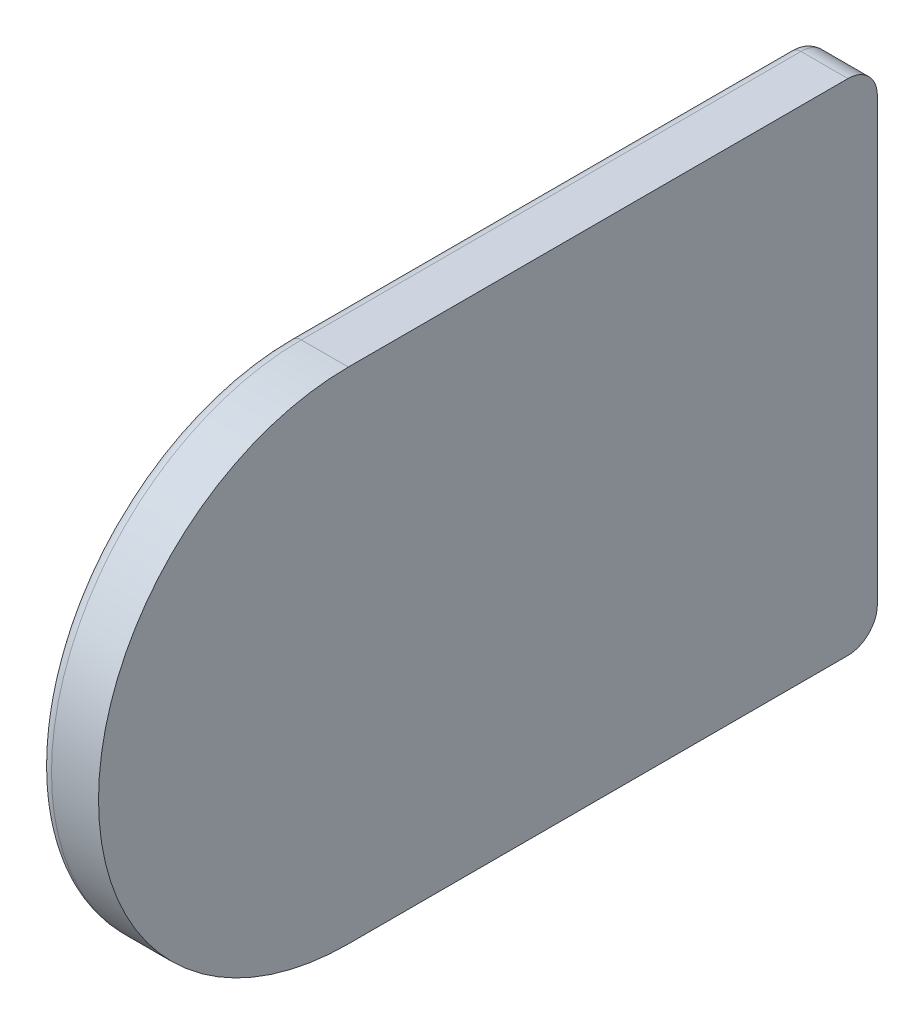
ISO-10303-21;
HEADER;
FILE_DESCRIPTION(('STEP AP214'),'2;1');
FILE_NAME('part.step','',(''),(''),'','','');
FILE_SCHEMA(('AUTOMOTIVE_DESIGN { 1 0 10303 214 1 1 1 1 }'));
ENDSEC;
DATA;
#1=APPLICATION_CONTEXT('core data for automotive mechanical design processes');
#2=APPLICATION_PROTOCOL_DEFINITION('international standard','automotive_design',2000,#1);
#3=PRODUCT_CONTEXT('',#1,'mechanical');
#4=PRODUCT('Part','Part','',(#3));
#5=PRODUCT_RELATED_PRODUCT_CATEGORY('part','',(#4));
#6=PRODUCT_DEFINITION_FORMATION('','',#4);
#7=PRODUCT_DEFINITION_CONTEXT('part definition',#1,'design');
#8=PRODUCT_DEFINITION('design','',#6,#7);
#9=PRODUCT_DEFINITION_SHAPE('','',#8);
#10=(LENGTH_UNIT() NAMED_UNIT(*) SI_UNIT(.MILLI.,.METRE.));
#11=(NAMED_UNIT(*) PLANE_ANGLE_UNIT() SI_UNIT($,.RADIAN.));
#12=(NAMED_UNIT(*) SI_UNIT($,.STERADIAN.) SOLID_ANGLE_UNIT());
#13=UNCERTAINTY_MEASURE_WITH_UNIT(LENGTH_MEASURE(1.E-05),#10,'distance_accuracy_value','');
#14=(GEOMETRIC_REPRESENTATION_CONTEXT(3) GLOBAL_UNCERTAINTY_ASSIGNED_CONTEXT((#13)) GLOBAL_UNIT_ASSIGNED_CONTEXT((#10,
#11,#12)) REPRESENTATION_CONTEXT('',''));
#15=CARTESIAN_POINT('',(0.,0.,0.));
#16=DIRECTION('',(0.,0.,1.));
#17=DIRECTION('',(1.,0.,0.));
#18=AXIS2_PLACEMENT_3D('',#15,#16,#17);
#19=CARTESIAN_POINT('',(0.,0.,45.));
#20=DIRECTION('',(1.,0.,0.));
#21=DIRECTION('',(0.,0.,-1.));
#22=AXIS2_PLACEMENT_3D('',#19,#20,#21);
#23=PLANE('',#22);
#24=DIRECTION('',(0.,0.,-1.));
#25=VECTOR('',#24,1.);
#26=CARTESIAN_POINT('',(0.,-16.25,1.99999999999998));
#27=LINE('',#26,#25);
#28=CARTESIAN_POINT('',(0.,-16.25,23.));
#29=VERTEX_POINT('',#28);
#30=CARTESIAN_POINT('',(0.,-16.25,1.99999999999998));
#31=VERTEX_POINT('',#30);
#32=EDGE_CURVE('E188',#29,#31,#27,.T.);
#33=ORIENTED_EDGE('',*,*,#32,.T.);
#34=DIRECTION('',(0.,1.,0.));
#35=VECTOR('',#34,1.);
#36=CARTESIAN_POINT('',(0.,-13.75,1.99999999999998));
#37=LINE('',#36,#35);
#38=CARTESIAN_POINT('',(0.,-13.75,1.99999999999998));
#39=VERTEX_POINT('',#38);
#40=EDGE_CURVE('E161',#31,#39,#37,.T.);
#41=ORIENTED_EDGE('',*,*,#40,.T.);
#42=DIRECTION('',(0.,0.,1.));
#43=VECTOR('',#42,1.);
#44=CARTESIAN_POINT('',(0.,-13.75,1.99999999999998));
#45=LINE('',#44,#43);
#46=CARTESIAN_POINT('',(0.,-13.75,23.));
#47=VERTEX_POINT('',#46);
#48=EDGE_CURVE('E177',#39,#47,#45,.T.);
#49=ORIENTED_EDGE('',*,*,#48,.T.);
#50=DIRECTION('',(0.,-1.,0.));
#51=VECTOR('',#50,1.);
#52=CARTESIAN_POINT('',(0.,-13.75,23.));
#53=LINE('',#52,#51);
#54=EDGE_CURVE('E52',#47,#29,#53,.T.);
#55=ORIENTED_EDGE('',*,*,#54,.T.);
#56=EDGE_LOOP('',(#33,#41,#49,#55));
#57=FACE_BOUND('',#56,.T.);
#58=CARTESIAN_POINT('',(0.,-37.5,-40.));
#59=DIRECTION('',(1.,0.,0.));
#60=DIRECTION('',(0.,0.,-1.));
#61=AXIS2_PLACEMENT_3D('',#58,#59,#60);
#62=CIRCLE('',#61,2.99999999999999);
#63=CARTESIAN_POINT('',(0.,-37.5,-43.));
#64=VERTEX_POINT('',#63);
#65=CARTESIAN_POINT('',(0.,-40.5,-40.));
#66=VERTEX_POINT('',#65);
#67=EDGE_CURVE('E271',#64,#66,#62,.F.);
#68=ORIENTED_EDGE('',*,*,#67,.T.);
#69=DIRECTION('',(0.,0.,-1.));
#70=VECTOR('',#69,1.);
#71=CARTESIAN_POINT('',(0.,-40.5,45.));
#72=LINE('',#71,#70);
#73=CARTESIAN_POINT('',(0.,-40.5,45.));
#74=VERTEX_POINT('',#73);
#75=EDGE_CURVE('E273',#66,#74,#72,.F.);
#76=ORIENTED_EDGE('',*,*,#75,.T.);
#77=CARTESIAN_POINT('',(0.,0.,45.));
#78=DIRECTION('',(1.,0.,0.));
#79=DIRECTION('',(0.,0.,-1.));
#80=AXIS2_PLACEMENT_3D('',#77,#78,#79);
#81=CIRCLE('',#80,40.5);
#82=CARTESIAN_POINT('',(0.,40.5,45.));
#83=VERTEX_POINT('',#82);
#84=EDGE_CURVE('E263',#74,#83,#81,.F.);
#85=ORIENTED_EDGE('',*,*,#84,.T.);
#86=DIRECTION('',(0.,0.,1.));
#87=VECTOR('',#86,1.);
#88=CARTESIAN_POINT('',(0.,40.5,45.));
#89=LINE('',#88,#87);
#90=CARTESIAN_POINT('',(0.,40.5,-40.));
#91=VERTEX_POINT('',#90);
#92=EDGE_CURVE('E265',#83,#91,#89,.F.);
#93=ORIENTED_EDGE('',*,*,#92,.T.);
#94=CARTESIAN_POINT('',(0.,37.5,-40.));
#95=DIRECTION('',(1.,0.,0.));
#96=DIRECTION('',(0.,0.,-1.));
#97=AXIS2_PLACEMENT_3D('',#94,#95,#96);
#98=CIRCLE('',#97,2.99999999999999);
#99=CARTESIAN_POINT('',(0.,37.5,-43.));
#100=VERTEX_POINT('',#99);
#101=EDGE_CURVE('E267',#91,#100,#98,.F.);
#102=ORIENTED_EDGE('',*,*,#101,.T.);
#103=DIRECTION('',(0.,1.,0.));
#104=VECTOR('',#103,1.);
#105=CARTESIAN_POINT('',(0.,0.,-43.));
#106=LINE('',#105,#104);
#107=EDGE_CURVE('E269',#100,#64,#106,.F.);
#108=ORIENTED_EDGE('',*,*,#107,.T.);
#109=EDGE_LOOP('',(#68,#76,#85,#93,#102,#108));
#110=FACE_BOUND('',#109,.T.);
#111=DIRECTION('',(0.,-1.,0.));
#112=VECTOR('',#111,1.);
#113=CARTESIAN_POINT('',(0.,13.75,1.99999999999998));
#114=LINE('',#113,#112);
#115=CARTESIAN_POINT('',(0.,16.25,1.99999999999998));
#116=VERTEX_POINT('',#115);
#117=CARTESIAN_POINT('',(0.,13.75,1.99999999999999));
#118=VERTEX_POINT('',#117);
#119=EDGE_CURVE('E166',#116,#118,#114,.T.);
#120=ORIENTED_EDGE('',*,*,#119,.F.);
#121=DIRECTION('',(0.,0.,-1.));
#122=VECTOR('',#121,1.);
#123=CARTESIAN_POINT('',(0.,16.25,1.99999999999998));
#124=LINE('',#123,#122);
#125=CARTESIAN_POINT('',(0.,16.25,23.));
#126=VERTEX_POINT('',#125);
#127=EDGE_CURVE('E202',#126,#116,#124,.T.);
#128=ORIENTED_EDGE('',*,*,#127,.F.);
#129=DIRECTION('',(0.,1.,0.));
#130=VECTOR('',#129,1.);
#131=CARTESIAN_POINT('',(0.,13.75,23.));
#132=LINE('',#131,#130);
#133=CARTESIAN_POINT('',(0.,13.75,23.));
#134=VERTEX_POINT('',#133);
#135=EDGE_CURVE('E212',#134,#126,#132,.T.);
#136=ORIENTED_EDGE('',*,*,#135,.F.);
#137=DIRECTION('',(0.,0.,1.));
#138=VECTOR('',#137,1.);
#139=CARTESIAN_POINT('',(0.,13.75,1.99999999999998));
#140=LINE('',#139,#138);
#141=EDGE_CURVE('E60',#118,#134,#140,.T.);
#142=ORIENTED_EDGE('',*,*,#141,.F.);
#143=EDGE_LOOP('',(#120,#128,#136,#142));
#144=FACE_BOUND('',#143,.T.);
#145=ADVANCED_FACE('F35',(#57,#110,#144),#23,.F.);
#146=CARTESIAN_POINT('',(10.,0.,45.));
#147=DIRECTION('',(-1.,0.,0.));
#148=DIRECTION('',(0.,0.,1.));
#149=AXIS2_PLACEMENT_3D('',#146,#147,#148);
#150=CYLINDRICAL_SURFACE('',#149,42.5);
#151=DIRECTION('',(-1.,0.,0.));
#152=VECTOR('',#151,1.);
#153=CARTESIAN_POINT('',(10.,42.5,45.));
#154=LINE('',#153,#152);
#155=CARTESIAN_POINT('',(10.,42.5,45.));
#156=VERTEX_POINT('',#155);
#157=CARTESIAN_POINT('',(2.,42.5,45.));
#158=VERTEX_POINT('',#157);
#159=EDGE_CURVE('E242',#156,#158,#154,.T.);
#160=ORIENTED_EDGE('',*,*,#159,.T.);
#161=CARTESIAN_POINT('',(2.,0.,45.));
#162=DIRECTION('',(1.,0.,0.));
#163=DIRECTION('',(0.,0.,-1.));
#164=AXIS2_PLACEMENT_3D('',#161,#162,#163);
#165=CIRCLE('',#164,42.5);
#166=CARTESIAN_POINT('',(2.,-42.5,45.));
#167=VERTEX_POINT('',#166);
#168=EDGE_CURVE('E11',#158,#167,#165,.T.);
#169=ORIENTED_EDGE('',*,*,#168,.T.);
#170=DIRECTION('',(-1.,0.,0.));
#171=VECTOR('',#170,1.);
#172=CARTESIAN_POINT('',(10.,-42.5,45.));
#173=LINE('',#172,#171);
#174=CARTESIAN_POINT('',(10.,-42.5,45.));
#175=VERTEX_POINT('',#174);
#176=EDGE_CURVE('E257',#175,#167,#173,.T.);
#177=ORIENTED_EDGE('',*,*,#176,.F.);
#178=CARTESIAN_POINT('',(10.,0.,45.));
#179=DIRECTION('',(1.,0.,0.));
#180=DIRECTION('',(0.,0.,-1.));
#181=AXIS2_PLACEMENT_3D('',#178,#179,#180);
#182=CIRCLE('',#181,42.5);
#183=EDGE_CURVE('E228',#156,#175,#182,.T.);
#184=ORIENTED_EDGE('',*,*,#183,.F.);
#185=EDGE_LOOP('',(#160,#169,#177,#184));
#186=FACE_BOUND('',#185,.T.);
#187=ADVANCED_FACE('F317',(#186),#150,.T.);
#188=CARTESIAN_POINT('',(10.,-42.5,45.));
#189=DIRECTION('',(0.,1.,0.));
#190=DIRECTION('',(0.,0.,1.));
#191=AXIS2_PLACEMENT_3D('',#188,#189,#190);
#192=PLANE('',#191);
#193=ORIENTED_EDGE('',*,*,#176,.T.);
#194=DIRECTION('',(0.,0.,-1.));
#195=VECTOR('',#194,1.);
#196=CARTESIAN_POINT('',(2.,-42.5,45.));
#197=LINE('',#196,#195);
#198=CARTESIAN_POINT('',(2.,-42.5,-40.));
#199=VERTEX_POINT('',#198);
#200=EDGE_CURVE('E260',#167,#199,#197,.T.);
#201=ORIENTED_EDGE('',*,*,#200,.T.);
#202=DIRECTION('',(-1.,0.,0.));
#203=VECTOR('',#202,1.);
#204=CARTESIAN_POINT('',(10.,-42.5,-40.));
#205=LINE('',#204,#203);
#206=CARTESIAN_POINT('',(10.,-42.5,-40.));
#207=VERTEX_POINT('',#206);
#208=EDGE_CURVE('E254',#207,#199,#205,.T.);
#209=ORIENTED_EDGE('',*,*,#208,.F.);
#210=DIRECTION('',(0.,0.,-1.));
#211=VECTOR('',#210,1.);
#212=CARTESIAN_POINT('',(10.,-42.5,45.));
#213=LINE('',#212,#211);
#214=EDGE_CURVE('E231',#175,#207,#213,.T.);
#215=ORIENTED_EDGE('',*,*,#214,.F.);
#216=EDGE_LOOP('',(#193,#201,#209,#215));
#217=FACE_BOUND('',#216,.T.);
#218=ADVANCED_FACE('F321',(#217),#192,.F.);
#219=CARTESIAN_POINT('',(10.,-37.5,-40.));
#220=DIRECTION('',(-1.,0.,0.));
#221=DIRECTION('',(0.,0.,1.));
#222=AXIS2_PLACEMENT_3D('',#219,#220,#221);
#223=CYLINDRICAL_SURFACE('',#222,4.99999999999999);
#224=ORIENTED_EDGE('',*,*,#208,.T.);
#225=CARTESIAN_POINT('',(2.,-37.5,-40.));
#226=DIRECTION('',(1.,0.,0.));
#227=DIRECTION('',(0.,0.,-1.));
#228=AXIS2_PLACEMENT_3D('',#225,#226,#227);
#229=CIRCLE('',#228,4.99999999999999);
#230=CARTESIAN_POINT('',(2.,-37.5,-45.));
#231=VERTEX_POINT('',#230);
#232=EDGE_CURVE('E276',#199,#231,#229,.T.);
#233=ORIENTED_EDGE('',*,*,#232,.T.);
#234=DIRECTION('',(-1.,0.,0.));
#235=VECTOR('',#234,1.);
#236=CARTESIAN_POINT('',(10.,-37.5,-45.));
#237=LINE('',#236,#235);
#238=CARTESIAN_POINT('',(10.,-37.5,-45.));
#239=VERTEX_POINT('',#238);
#240=EDGE_CURVE('E251',#239,#231,#237,.T.);
#241=ORIENTED_EDGE('',*,*,#240,.F.);
#242=CARTESIAN_POINT('',(10.,-37.5,-40.));
#243=DIRECTION('',(1.,0.,0.));
#244=DIRECTION('',(0.,0.,-1.));
#245=AXIS2_PLACEMENT_3D('',#242,#243,#244);
#246=CIRCLE('',#245,4.99999999999999);
#247=EDGE_CURVE('E234',#207,#239,#246,.T.);
#248=ORIENTED_EDGE('',*,*,#247,.F.);
#249=EDGE_LOOP('',(#224,#233,#241,#248));
#250=FACE_BOUND('',#249,.T.);
#251=ADVANCED_FACE('F374',(#250),#223,.T.);
#252=CARTESIAN_POINT('',(10.,-37.5,-45.));
#253=DIRECTION('',(0.,0.,1.));
#254=DIRECTION('',(0.,-1.,0.));
#255=AXIS2_PLACEMENT_3D('',#252,#253,#254);
#256=PLANE('',#255);
#257=ORIENTED_EDGE('',*,*,#240,.T.);
#258=DIRECTION('',(0.,1.,0.));
#259=VECTOR('',#258,1.);
#260=CARTESIAN_POINT('',(2.,-37.5,-45.));
#261=LINE('',#260,#259);
#262=CARTESIAN_POINT('',(2.,37.5,-45.));
#263=VERTEX_POINT('',#262);
#264=EDGE_CURVE('E278',#231,#263,#261,.T.);
#265=ORIENTED_EDGE('',*,*,#264,.T.);
#266=DIRECTION('',(-1.,0.,0.));
#267=VECTOR('',#266,1.);
#268=CARTESIAN_POINT('',(10.,37.5,-45.));
#269=LINE('',#268,#267);
#270=CARTESIAN_POINT('',(10.,37.5,-45.));
#271=VERTEX_POINT('',#270);
#272=EDGE_CURVE('E248',#271,#263,#269,.T.);
#273=ORIENTED_EDGE('',*,*,#272,.F.);
#274=DIRECTION('',(0.,1.,0.));
#275=VECTOR('',#274,1.);
#276=CARTESIAN_POINT('',(10.,-37.5,-45.));
#277=LINE('',#276,#275);
#278=EDGE_CURVE('E236',#239,#271,#277,.T.);
#279=ORIENTED_EDGE('',*,*,#278,.F.);
#280=EDGE_LOOP('',(#257,#265,#273,#279));
#281=FACE_BOUND('',#280,.T.);
#282=ADVANCED_FACE('F336',(#281),#256,.F.);
#283=CARTESIAN_POINT('',(10.,37.5,-40.));
#284=DIRECTION('',(-1.,0.,0.));
#285=DIRECTION('',(0.,0.,1.));
#286=AXIS2_PLACEMENT_3D('',#283,#284,#285);
#287=CYLINDRICAL_SURFACE('',#286,4.99999999999999);
#288=ORIENTED_EDGE('',*,*,#272,.T.);
#289=CARTESIAN_POINT('',(2.,37.5,-40.));
#290=DIRECTION('',(1.,0.,0.));
#291=DIRECTION('',(0.,0.,-1.));
#292=AXIS2_PLACEMENT_3D('',#289,#290,#291);
#293=CIRCLE('',#292,4.99999999999999);
#294=CARTESIAN_POINT('',(2.,42.5,-40.));
#295=VERTEX_POINT('',#294);
#296=EDGE_CURVE('E280',#263,#295,#293,.T.);
#297=ORIENTED_EDGE('',*,*,#296,.T.);
#298=DIRECTION('',(-1.,0.,0.));
#299=VECTOR('',#298,1.);
#300=CARTESIAN_POINT('',(10.,42.5,-40.));
#301=LINE('',#300,#299);
#302=CARTESIAN_POINT('',(10.,42.5,-40.));
#303=VERTEX_POINT('',#302);
#304=EDGE_CURVE('E245',#303,#295,#301,.T.);
#305=ORIENTED_EDGE('',*,*,#304,.F.);
#306=CARTESIAN_POINT('',(10.,37.5,-40.));
#307=DIRECTION('',(1.,0.,0.));
#308=DIRECTION('',(0.,0.,1.));
#309=AXIS2_PLACEMENT_3D('',#306,#307,#308);
#310=CIRCLE('',#309,4.99999999999999);
#311=EDGE_CURVE('E238',#271,#303,#310,.T.);
#312=ORIENTED_EDGE('',*,*,#311,.F.);
#313=EDGE_LOOP('',(#288,#297,#305,#312));
#314=FACE_BOUND('',#313,.T.);
#315=ADVANCED_FACE('F332',(#314),#287,.T.);
#316=CARTESIAN_POINT('',(10.,42.5,45.));
#317=DIRECTION('',(0.,-1.,0.));
#318=DIRECTION('',(0.,0.,-1.));
#319=AXIS2_PLACEMENT_3D('',#316,#317,#318);
#320=PLANE('',#319);
#321=ORIENTED_EDGE('',*,*,#304,.T.);
#322=DIRECTION('',(0.,0.,1.));
#323=VECTOR('',#322,1.);
#324=CARTESIAN_POINT('',(2.,42.5,45.));
#325=LINE('',#324,#323);
#326=EDGE_CURVE('E44',#295,#158,#325,.T.);
#327=ORIENTED_EDGE('',*,*,#326,.T.);
#328=ORIENTED_EDGE('',*,*,#159,.F.);
#329=DIRECTION('',(0.,0.,1.));
#330=VECTOR('',#329,1.);
#331=CARTESIAN_POINT('',(10.,42.5,45.));
#332=LINE('',#331,#330);
#333=EDGE_CURVE('E240',#303,#156,#332,.T.);
#334=ORIENTED_EDGE('',*,*,#333,.F.);
#335=EDGE_LOOP('',(#321,#327,#328,#334));
#336=FACE_BOUND('',#335,.T.);
#337=ADVANCED_FACE('F330',(#336),#320,.F.);
#338=CARTESIAN_POINT('',(10.,0.,45.));
#339=DIRECTION('',(1.,0.,0.));
#340=DIRECTION('',(0.,0.,-1.));
#341=AXIS2_PLACEMENT_3D('',#338,#339,#340);
#342=PLANE('',#341);
#343=ORIENTED_EDGE('',*,*,#183,.T.);
#344=ORIENTED_EDGE('',*,*,#214,.T.);
#345=ORIENTED_EDGE('',*,*,#247,.T.);
#346=ORIENTED_EDGE('',*,*,#278,.T.);
#347=ORIENTED_EDGE('',*,*,#311,.T.);
#348=ORIENTED_EDGE('',*,*,#333,.T.);
#349=EDGE_LOOP('',(#343,#344,#345,#346,#347,#348));
#350=FACE_BOUND('',#349,.T.);
#351=ADVANCED_FACE('F325',(#350),#342,.T.);
#352=CARTESIAN_POINT('',(2.,37.5,-40.));
#353=DIRECTION('',(1.,0.,0.));
#354=DIRECTION('',(0.,0.,-1.));
#355=AXIS2_PLACEMENT_3D('',#352,#353,#354);
#356=TOROIDAL_SURFACE('',#355,2.99999999999999,2.);
#357=CARTESIAN_POINT('',(2.,37.5,-43.));
#358=DIRECTION('',(0.,-1.,0.));
#359=DIRECTION('',(0.,0.,-1.));
#360=AXIS2_PLACEMENT_3D('',#357,#358,#359);
#361=CIRCLE('',#360,2.);
#362=EDGE_CURVE('E292',#100,#263,#361,.T.);
#363=ORIENTED_EDGE('',*,*,#362,.F.);
#364=ORIENTED_EDGE('',*,*,#101,.F.);
#365=CARTESIAN_POINT('',(2.,40.5,-40.));
#366=DIRECTION('',(0.,0.,1.));
#367=DIRECTION('',(1.,0.,0.));
#368=AXIS2_PLACEMENT_3D('',#365,#366,#367);
#369=CIRCLE('',#368,2.);
#370=EDGE_CURVE('E232',#295,#91,#369,.T.);
#371=ORIENTED_EDGE('',*,*,#370,.F.);
#372=ORIENTED_EDGE('',*,*,#296,.F.);
#373=EDGE_LOOP('',(#363,#364,#371,#372));
#374=FACE_BOUND('',#373,.T.);
#375=ADVANCED_FACE('F37',(#374),#356,.T.);
#376=CARTESIAN_POINT('',(2.,40.5,45.));
#377=DIRECTION('',(0.,0.,1.));
#378=DIRECTION('',(1.,0.,0.));
#379=AXIS2_PLACEMENT_3D('',#376,#377,#378);
#380=CYLINDRICAL_SURFACE('',#379,2.);
#381=ORIENTED_EDGE('',*,*,#370,.T.);
#382=ORIENTED_EDGE('',*,*,#92,.F.);
#383=CARTESIAN_POINT('',(2.,40.5,45.));
#384=DIRECTION('',(0.,0.,1.));
#385=DIRECTION('',(1.,0.,0.));
#386=AXIS2_PLACEMENT_3D('',#383,#384,#385);
#387=CIRCLE('',#386,2.);
#388=EDGE_CURVE('E289',#158,#83,#387,.T.);
#389=ORIENTED_EDGE('',*,*,#388,.F.);
#390=ORIENTED_EDGE('',*,*,#326,.F.);
#391=EDGE_LOOP('',(#381,#382,#389,#390));
#392=FACE_BOUND('',#391,.T.);
#393=ADVANCED_FACE('F299',(#392),#380,.T.);
#394=CARTESIAN_POINT('',(2.,-37.5,-43.));
#395=DIRECTION('',(0.,1.,0.));
#396=DIRECTION('',(0.,0.,1.));
#397=AXIS2_PLACEMENT_3D('',#394,#395,#396);
#398=CYLINDRICAL_SURFACE('',#397,2.);
#399=ORIENTED_EDGE('',*,*,#362,.T.);
#400=ORIENTED_EDGE('',*,*,#264,.F.);
#401=CARTESIAN_POINT('',(2.,-37.5,-43.));
#402=DIRECTION('',(0.,-1.,0.));
#403=DIRECTION('',(0.,0.,-1.));
#404=AXIS2_PLACEMENT_3D('',#401,#402,#403);
#405=CIRCLE('',#404,2.);
#406=EDGE_CURVE('E286',#64,#231,#405,.T.);
#407=ORIENTED_EDGE('',*,*,#406,.F.);
#408=ORIENTED_EDGE('',*,*,#107,.F.);
#409=EDGE_LOOP('',(#399,#400,#407,#408));
#410=FACE_BOUND('',#409,.T.);
#411=ADVANCED_FACE('F340',(#410),#398,.T.);
#412=CARTESIAN_POINT('',(2.,0.,45.));
#413=DIRECTION('',(1.,0.,0.));
#414=DIRECTION('',(0.,0.,-1.));
#415=AXIS2_PLACEMENT_3D('',#412,#413,#414);
#416=TOROIDAL_SURFACE('',#415,40.5,2.);
#417=ORIENTED_EDGE('',*,*,#388,.T.);
#418=ORIENTED_EDGE('',*,*,#84,.F.);
#419=CARTESIAN_POINT('',(2.,-40.5,45.));
#420=DIRECTION('',(0.,0.,-1.));
#421=DIRECTION('',(-1.,0.,0.));
#422=AXIS2_PLACEMENT_3D('',#419,#420,#421);
#423=CIRCLE('',#422,2.);
#424=EDGE_CURVE('E284',#167,#74,#423,.T.);
#425=ORIENTED_EDGE('',*,*,#424,.F.);
#426=ORIENTED_EDGE('',*,*,#168,.F.);
#427=EDGE_LOOP('',(#417,#418,#425,#426));
#428=FACE_BOUND('',#427,.T.);
#429=ADVANCED_FACE('F312',(#428),#416,.T.);
#430=CARTESIAN_POINT('',(2.,-37.5,-40.));
#431=DIRECTION('',(1.,0.,0.));
#432=DIRECTION('',(0.,0.,-1.));
#433=AXIS2_PLACEMENT_3D('',#430,#431,#432);
#434=TOROIDAL_SURFACE('',#433,2.99999999999999,2.);
#435=ORIENTED_EDGE('',*,*,#406,.T.);
#436=ORIENTED_EDGE('',*,*,#232,.F.);
#437=CARTESIAN_POINT('',(2.,-40.5,-40.));
#438=DIRECTION('',(0.,0.,1.));
#439=DIRECTION('',(1.,0.,0.));
#440=AXIS2_PLACEMENT_3D('',#437,#438,#439);
#441=CIRCLE('',#440,2.);
#442=EDGE_CURVE('E227',#66,#199,#441,.T.);
#443=ORIENTED_EDGE('',*,*,#442,.F.);
#444=ORIENTED_EDGE('',*,*,#67,.F.);
#445=EDGE_LOOP('',(#435,#436,#443,#444));
#446=FACE_BOUND('',#445,.T.);
#447=ADVANCED_FACE('F344',(#446),#434,.T.);
#448=CARTESIAN_POINT('',(2.,-40.5,45.));
#449=DIRECTION('',(0.,0.,-1.));
#450=DIRECTION('',(0.,1.,0.));
#451=AXIS2_PLACEMENT_3D('',#448,#449,#450);
#452=CYLINDRICAL_SURFACE('',#451,2.);
#453=ORIENTED_EDGE('',*,*,#424,.T.);
#454=ORIENTED_EDGE('',*,*,#75,.F.);
#455=ORIENTED_EDGE('',*,*,#442,.T.);
#456=ORIENTED_EDGE('',*,*,#200,.F.);
#457=EDGE_LOOP('',(#453,#454,#455,#456));
#458=FACE_BOUND('',#457,.T.);
#459=ADVANCED_FACE('F347',(#458),#452,.T.);
#460=CARTESIAN_POINT('',(-20.,13.75,1.99999999999998));
#461=DIRECTION('',(0.,0.,1.));
#462=DIRECTION('',(0.,-1.,0.));
#463=AXIS2_PLACEMENT_3D('',#460,#461,#462);
#464=PLANE('',#463);
#465=ORIENTED_EDGE('',*,*,#119,.T.);
#466=DIRECTION('',(1.,0.,0.));
#467=VECTOR('',#466,1.);
#468=CARTESIAN_POINT('',(-20.,13.75,1.99999999999998));
#469=LINE('',#468,#467);
#470=CARTESIAN_POINT('',(-20.,13.75,1.99999999999998));
#471=VERTEX_POINT('',#470);
#472=EDGE_CURVE('E225',#471,#118,#469,.T.);
#473=ORIENTED_EDGE('',*,*,#472,.F.);
#474=DIRECTION('',(0.,-1.,0.));
#475=VECTOR('',#474,1.);
#476=CARTESIAN_POINT('',(-20.,13.75,1.99999999999998));
#477=LINE('',#476,#475);
#478=CARTESIAN_POINT('',(-20.,16.25,1.99999999999998));
#479=VERTEX_POINT('',#478);
#480=EDGE_CURVE('E198',#479,#471,#477,.T.);
#481=ORIENTED_EDGE('',*,*,#480,.F.);
#482=DIRECTION('',(1.,0.,0.));
#483=VECTOR('',#482,1.);
#484=CARTESIAN_POINT('',(-20.,16.25,1.99999999999998));
#485=LINE('',#484,#483);
#486=EDGE_CURVE('E208',#479,#116,#485,.T.);
#487=ORIENTED_EDGE('',*,*,#486,.T.);
#488=EDGE_LOOP('',(#465,#473,#481,#487));
#489=FACE_BOUND('',#488,.T.);
#490=ADVANCED_FACE('F349',(#489),#464,.F.);
#491=CARTESIAN_POINT('',(-20.,13.75,1.99999999999998));
#492=DIRECTION('',(0.,1.,0.));
#493=DIRECTION('',(0.,0.,1.));
#494=AXIS2_PLACEMENT_3D('',#491,#492,#493);
#495=PLANE('',#494);
#496=CARTESIAN_POINT('',(-13.,13.75,12.5));
#497=DIRECTION('',(0.,1.,0.));
#498=DIRECTION('',(0.,0.,1.));
#499=AXIS2_PLACEMENT_3D('',#496,#497,#498);
#500=CIRCLE('',#499,2.25);
#501=CARTESIAN_POINT('',(-13.,13.75,14.75));
#502=VERTEX_POINT('',#501);
#503=EDGE_CURVE('E189',#502,#502,#500,.T.);
#504=ORIENTED_EDGE('',*,*,#503,.T.);
#505=EDGE_LOOP('',(#504));
#506=FACE_BOUND('',#505,.T.);
#507=ORIENTED_EDGE('',*,*,#141,.T.);
#508=DIRECTION('',(1.,0.,0.));
#509=VECTOR('',#508,1.);
#510=CARTESIAN_POINT('',(-20.,13.75,23.));
#511=LINE('',#510,#509);
#512=CARTESIAN_POINT('',(-20.,13.75,23.));
#513=VERTEX_POINT('',#512);
#514=EDGE_CURVE('E222',#513,#134,#511,.T.);
#515=ORIENTED_EDGE('',*,*,#514,.F.);
#516=DIRECTION('',(0.,0.,1.));
#517=VECTOR('',#516,1.);
#518=CARTESIAN_POINT('',(-20.,13.75,1.99999999999998));
#519=LINE('',#518,#517);
#520=EDGE_CURVE('E201',#471,#513,#519,.T.);
#521=ORIENTED_EDGE('',*,*,#520,.F.);
#522=ORIENTED_EDGE('',*,*,#472,.T.);
#523=EDGE_LOOP('',(#507,#515,#521,#522));
#524=FACE_BOUND('',#523,.T.);
#525=ADVANCED_FACE('F355',(#506,#524),#495,.F.);
#526=CARTESIAN_POINT('',(-20.,13.75,23.));
#527=DIRECTION('',(0.,0.,-1.));
#528=DIRECTION('',(-1.,0.,0.));
#529=AXIS2_PLACEMENT_3D('',#526,#527,#528);
#530=PLANE('',#529);
#531=ORIENTED_EDGE('',*,*,#135,.T.);
#532=DIRECTION('',(1.,0.,0.));
#533=VECTOR('',#532,1.);
#534=CARTESIAN_POINT('',(-20.,16.25,23.));
#535=LINE('',#534,#533);
#536=CARTESIAN_POINT('',(-20.,16.25,23.));
#537=VERTEX_POINT('',#536);
#538=EDGE_CURVE('E219',#537,#126,#535,.T.);
#539=ORIENTED_EDGE('',*,*,#538,.F.);
#540=DIRECTION('',(0.,1.,0.));
#541=VECTOR('',#540,1.);
#542=CARTESIAN_POINT('',(-20.,13.75,23.));
#543=LINE('',#542,#541);
#544=EDGE_CURVE('E204',#513,#537,#543,.T.);
#545=ORIENTED_EDGE('',*,*,#544,.F.);
#546=ORIENTED_EDGE('',*,*,#514,.T.);
#547=EDGE_LOOP('',(#531,#539,#545,#546));
#548=FACE_BOUND('',#547,.T.);
#549=ADVANCED_FACE('F448',(#548),#530,.F.);
#550=CARTESIAN_POINT('',(-20.,16.25,1.99999999999998));
#551=DIRECTION('',(0.,-1.,0.));
#552=DIRECTION('',(0.,0.,-1.));
#553=AXIS2_PLACEMENT_3D('',#550,#551,#552);
#554=PLANE('',#553);
#555=CARTESIAN_POINT('',(-13.,16.25,12.5));
#556=DIRECTION('',(0.,1.,0.));
#557=DIRECTION('',(0.,0.,1.));
#558=AXIS2_PLACEMENT_3D('',#555,#556,#557);
#559=CIRCLE('',#558,2.25);
#560=CARTESIAN_POINT('',(-13.,16.25,14.75));
#561=VERTEX_POINT('',#560);
#562=EDGE_CURVE('E553',#561,#561,#559,.T.);
#563=ORIENTED_EDGE('',*,*,#562,.F.);
#564=EDGE_LOOP('',(#563));
#565=FACE_BOUND('',#564,.T.);
#566=ORIENTED_EDGE('',*,*,#127,.T.);
#567=ORIENTED_EDGE('',*,*,#486,.F.);
#568=DIRECTION('',(0.,0.,-1.));
#569=VECTOR('',#568,1.);
#570=CARTESIAN_POINT('',(-20.,16.25,1.99999999999998));
#571=LINE('',#570,#569);
#572=EDGE_CURVE('E206',#537,#479,#571,.T.);
#573=ORIENTED_EDGE('',*,*,#572,.F.);
#574=ORIENTED_EDGE('',*,*,#538,.T.);
#575=EDGE_LOOP('',(#566,#567,#573,#574));
#576=FACE_BOUND('',#575,.T.);
#577=ADVANCED_FACE('F453',(#565,#576),#554,.F.);
#578=CARTESIAN_POINT('',(-20.,0.,0.));
#579=DIRECTION('',(1.,0.,0.));
#580=DIRECTION('',(0.,0.,-1.));
#581=AXIS2_PLACEMENT_3D('',#578,#579,#580);
#582=PLANE('',#581);
#583=ORIENTED_EDGE('',*,*,#480,.T.);
#584=ORIENTED_EDGE('',*,*,#520,.T.);
#585=ORIENTED_EDGE('',*,*,#544,.T.);
#586=ORIENTED_EDGE('',*,*,#572,.T.);
#587=EDGE_LOOP('',(#583,#584,#585,#586));
#588=FACE_BOUND('',#587,.T.);
#589=ADVANCED_FACE('F461',(#588),#582,.F.);
#590=CARTESIAN_POINT('',(-20.,-13.75,1.99999999999998));
#591=DIRECTION('',(0.,0.,-1.));
#592=DIRECTION('',(0.,1.,0.));
#593=AXIS2_PLACEMENT_3D('',#590,#591,#592);
#594=PLANE('',#593);
#595=ORIENTED_EDGE('',*,*,#40,.F.);
#596=DIRECTION('',(1.,0.,0.));
#597=VECTOR('',#596,1.);
#598=CARTESIAN_POINT('',(-20.,-16.25,1.99999999999998));
#599=LINE('',#598,#597);
#600=CARTESIAN_POINT('',(-20.,-16.25,1.99999999999998));
#601=VERTEX_POINT('',#600);
#602=EDGE_CURVE('E155',#601,#31,#599,.T.);
#603=ORIENTED_EDGE('',*,*,#602,.F.);
#604=DIRECTION('',(0.,1.,0.));
#605=VECTOR('',#604,1.);
#606=CARTESIAN_POINT('',(-20.,-13.75,1.99999999999998));
#607=LINE('',#606,#605);
#608=CARTESIAN_POINT('',(-20.,-13.75,1.99999999999998));
#609=VERTEX_POINT('',#608);
#610=EDGE_CURVE('E158',#601,#609,#607,.T.);
#611=ORIENTED_EDGE('',*,*,#610,.T.);
#612=DIRECTION('',(1.,0.,0.));
#613=VECTOR('',#612,1.);
#614=CARTESIAN_POINT('',(-20.,-13.75,1.99999999999998));
#615=LINE('',#614,#613);
#616=EDGE_CURVE('E186',#609,#39,#615,.T.);
#617=ORIENTED_EDGE('',*,*,#616,.T.);
#618=EDGE_LOOP('',(#595,#603,#611,#617));
#619=FACE_BOUND('',#618,.T.);
#620=ADVANCED_FACE('F157',(#619),#594,.T.);
#621=CARTESIAN_POINT('',(-20.,-16.25,1.99999999999998));
#622=DIRECTION('',(0.,-1.,0.));
#623=DIRECTION('',(0.,0.,-1.));
#624=AXIS2_PLACEMENT_3D('',#621,#622,#623);
#625=PLANE('',#624);
#626=CARTESIAN_POINT('',(-13.,-16.25,12.5));
#627=DIRECTION('',(0.,-1.,0.));
#628=DIRECTION('',(0.,0.,-1.));
#629=AXIS2_PLACEMENT_3D('',#626,#627,#628);
#630=CIRCLE('',#629,2.25);
#631=CARTESIAN_POINT('',(-13.,-16.25,10.25));
#632=VERTEX_POINT('',#631);
#633=EDGE_CURVE('E556',#632,#632,#630,.T.);
#634=ORIENTED_EDGE('',*,*,#633,.F.);
#635=EDGE_LOOP('',(#634));
#636=FACE_BOUND('',#635,.T.);
#637=ORIENTED_EDGE('',*,*,#32,.F.);
#638=DIRECTION('',(1.,0.,0.));
#639=VECTOR('',#638,1.);
#640=CARTESIAN_POINT('',(-20.,-16.25,23.));
#641=LINE('',#640,#639);
#642=CARTESIAN_POINT('',(-20.,-16.25,23.));
#643=VERTEX_POINT('',#642);
#644=EDGE_CURVE('E167',#643,#29,#641,.T.);
#645=ORIENTED_EDGE('',*,*,#644,.F.);
#646=DIRECTION('',(0.,0.,-1.));
#647=VECTOR('',#646,1.);
#648=CARTESIAN_POINT('',(-20.,-16.25,1.99999999999998));
#649=LINE('',#648,#647);
#650=EDGE_CURVE('E173',#643,#601,#649,.T.);
#651=ORIENTED_EDGE('',*,*,#650,.T.);
#652=ORIENTED_EDGE('',*,*,#602,.T.);
#653=EDGE_LOOP('',(#637,#645,#651,#652));
#654=FACE_BOUND('',#653,.T.);
#655=ADVANCED_FACE('F179',(#636,#654),#625,.T.);
#656=CARTESIAN_POINT('',(-20.,-13.75,23.));
#657=DIRECTION('',(0.,0.,1.));
#658=DIRECTION('',(1.,0.,0.));
#659=AXIS2_PLACEMENT_3D('',#656,#657,#658);
#660=PLANE('',#659);
#661=ORIENTED_EDGE('',*,*,#54,.F.);
#662=DIRECTION('',(1.,0.,0.));
#663=VECTOR('',#662,1.);
#664=CARTESIAN_POINT('',(-20.,-13.75,23.));
#665=LINE('',#664,#663);
#666=CARTESIAN_POINT('',(-20.,-13.75,23.));
#667=VERTEX_POINT('',#666);
#668=EDGE_CURVE('E195',#667,#47,#665,.T.);
#669=ORIENTED_EDGE('',*,*,#668,.F.);
#670=DIRECTION('',(0.,-1.,0.));
#671=VECTOR('',#670,1.);
#672=CARTESIAN_POINT('',(-20.,-13.75,23.));
#673=LINE('',#672,#671);
#674=EDGE_CURVE('E180',#667,#643,#673,.T.);
#675=ORIENTED_EDGE('',*,*,#674,.T.);
#676=ORIENTED_EDGE('',*,*,#644,.T.);
#677=EDGE_LOOP('',(#661,#669,#675,#676));
#678=FACE_BOUND('',#677,.T.);
#679=ADVANCED_FACE('F484',(#678),#660,.T.);
#680=CARTESIAN_POINT('',(-20.,-13.75,1.99999999999998));
#681=DIRECTION('',(0.,1.,0.));
#682=DIRECTION('',(0.,0.,1.));
#683=AXIS2_PLACEMENT_3D('',#680,#681,#682);
#684=PLANE('',#683);
#685=CARTESIAN_POINT('',(-13.,-13.75,12.5));
#686=DIRECTION('',(0.,1.,0.));
#687=DIRECTION('',(0.,0.,1.));
#688=AXIS2_PLACEMENT_3D('',#685,#686,#687);
#689=CIRCLE('',#688,2.25);
#690=CARTESIAN_POINT('',(-13.,-13.75,14.75));
#691=VERTEX_POINT('',#690);
#692=EDGE_CURVE('E39',#691,#691,#689,.T.);
#693=ORIENTED_EDGE('',*,*,#692,.F.);
#694=EDGE_LOOP('',(#693));
#695=FACE_BOUND('',#694,.T.);
#696=ORIENTED_EDGE('',*,*,#48,.F.);
#697=ORIENTED_EDGE('',*,*,#616,.F.);
#698=DIRECTION('',(0.,0.,1.));
#699=VECTOR('',#698,1.);
#700=CARTESIAN_POINT('',(-20.,-13.75,1.99999999999998));
#701=LINE('',#700,#699);
#702=EDGE_CURVE('E176',#609,#667,#701,.T.);
#703=ORIENTED_EDGE('',*,*,#702,.T.);
#704=ORIENTED_EDGE('',*,*,#668,.T.);
#705=EDGE_LOOP('',(#696,#697,#703,#704));
#706=FACE_BOUND('',#705,.T.);
#707=ADVANCED_FACE('F489',(#695,#706),#684,.T.);
#708=CARTESIAN_POINT('',(-20.,0.,0.));
#709=DIRECTION('',(1.,0.,0.));
#710=DIRECTION('',(0.,0.,-1.));
#711=AXIS2_PLACEMENT_3D('',#708,#709,#710);
#712=PLANE('',#711);
#713=ORIENTED_EDGE('',*,*,#610,.F.);
#714=ORIENTED_EDGE('',*,*,#650,.F.);
#715=ORIENTED_EDGE('',*,*,#674,.F.);
#716=ORIENTED_EDGE('',*,*,#702,.F.);
#717=EDGE_LOOP('',(#713,#714,#715,#716));
#718=FACE_BOUND('',#717,.T.);
#719=ADVANCED_FACE('F171',(#718),#712,.F.);
#720=CARTESIAN_POINT('',(-13.,-42.5,12.5));
#721=DIRECTION('',(0.,1.,0.));
#722=DIRECTION('',(0.,0.,1.));
#723=AXIS2_PLACEMENT_3D('',#720,#721,#722);
#724=CYLINDRICAL_SURFACE('',#723,2.25);
#725=ORIENTED_EDGE('',*,*,#633,.T.);
#726=EDGE_LOOP('',(#725));
#727=FACE_BOUND('',#726,.T.);
#728=ORIENTED_EDGE('',*,*,#692,.T.);
#729=EDGE_LOOP('',(#728));
#730=FACE_BOUND('',#729,.T.);
#731=ADVANCED_FACE('F500',(#727,#730),#724,.F.);
#732=ORIENTED_EDGE('',*,*,#562,.T.);
#733=EDGE_LOOP('',(#732));
#734=FACE_BOUND('',#733,.T.);
#735=ORIENTED_EDGE('',*,*,#503,.F.);
#736=EDGE_LOOP('',(#735));
#737=FACE_BOUND('',#736,.T.);
#738=ADVANCED_FACE('F537',(#734,#737),#724,.F.);
#739=CLOSED_SHELL('',(#145,#187,#218,#251,#282,#315,#337,#351,#375,#393,#411,#429,#447,#459,
#490,#525,#549,#577,#589,#620,#655,#679,#707,#719,#731,#738));
#740=MANIFOLD_SOLID_BREP('B2',#739);
#741=ADVANCED_BREP_SHAPE_REPRESENTATION('',(#18,#740),#14);
#742=SHAPE_DEFINITION_REPRESENTATION(#9,#741);
ENDSEC;
END-ISO-10303-21;
